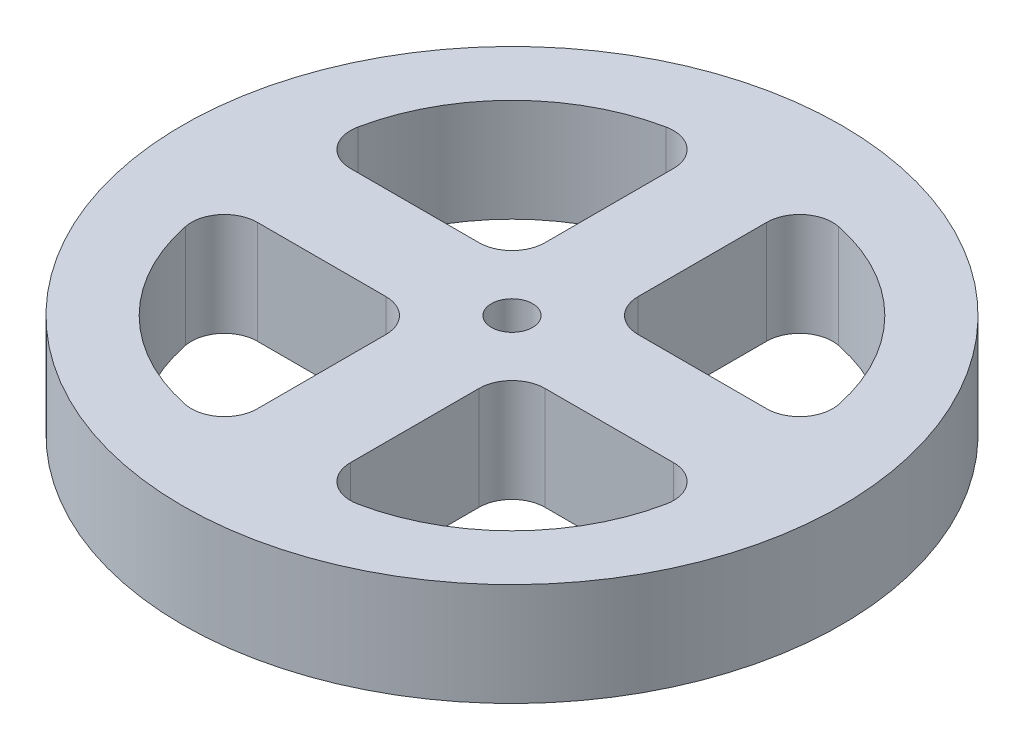
ISO-10303-21;
HEADER;
FILE_DESCRIPTION(('STEP AP214'),'2;1');
FILE_NAME('part.step','',(''),(''),'','','');
FILE_SCHEMA(('AUTOMOTIVE_DESIGN { 1 0 10303 214 1 1 1 1 }'));
ENDSEC;
DATA;
#1=APPLICATION_CONTEXT('core data for automotive mechanical design processes');
#2=APPLICATION_PROTOCOL_DEFINITION('international standard','automotive_design',2000,#1);
#3=PRODUCT_CONTEXT('',#1,'mechanical');
#4=PRODUCT('Part','Part','',(#3));
#5=PRODUCT_RELATED_PRODUCT_CATEGORY('part','',(#4));
#6=PRODUCT_DEFINITION_FORMATION('','',#4);
#7=PRODUCT_DEFINITION_CONTEXT('part definition',#1,'design');
#8=PRODUCT_DEFINITION('design','',#6,#7);
#9=PRODUCT_DEFINITION_SHAPE('','',#8);
#10=(LENGTH_UNIT() NAMED_UNIT(*) SI_UNIT(.MILLI.,.METRE.));
#11=(NAMED_UNIT(*) PLANE_ANGLE_UNIT() SI_UNIT($,.RADIAN.));
#12=(NAMED_UNIT(*) SI_UNIT($,.STERADIAN.) SOLID_ANGLE_UNIT());
#13=UNCERTAINTY_MEASURE_WITH_UNIT(LENGTH_MEASURE(1.E-05),#10,'distance_accuracy_value','');
#14=(GEOMETRIC_REPRESENTATION_CONTEXT(3) GLOBAL_UNCERTAINTY_ASSIGNED_CONTEXT((#13)) GLOBAL_UNIT_ASSIGNED_CONTEXT((#10,
#11,#12)) REPRESENTATION_CONTEXT('',''));
#15=CARTESIAN_POINT('',(0.,0.,0.));
#16=DIRECTION('',(0.,0.,1.));
#17=DIRECTION('',(1.,0.,0.));
#18=AXIS2_PLACEMENT_3D('',#15,#16,#17);
#19=CARTESIAN_POINT('',(0.,1.5875,0.));
#20=DIRECTION('',(0.,1.,0.));
#21=DIRECTION('',(0.,0.,1.));
#22=AXIS2_PLACEMENT_3D('',#19,#20,#21);
#23=PLANE('',#22);
#24=DIRECTION('',(-1.,0.,0.));
#25=VECTOR('',#24,1.);
#26=CARTESIAN_POINT('',(-0.718420489685532,1.5875,0.718420489685534));
#27=LINE('',#26,#25);
#28=CARTESIAN_POINT('',(-1.22642048968553,1.5875,0.718420489685534));
#29=VERTEX_POINT('',#28);
#30=CARTESIAN_POINT('',(-3.20710206835324,1.5875,0.718420489685533));
#31=VERTEX_POINT('',#30);
#32=EDGE_CURVE('E212',#29,#31,#27,.T.);
#33=ORIENTED_EDGE('',*,*,#32,.F.);
#34=CARTESIAN_POINT('',(-1.22642048968553,1.5875,1.22642048968553));
#35=DIRECTION('',(0.,1.,0.));
#36=DIRECTION('',(0.,0.,1.));
#37=AXIS2_PLACEMENT_3D('',#34,#35,#36);
#38=CIRCLE('',#37,0.508);
#39=CARTESIAN_POINT('',(-0.718420489685532,1.5875,1.22642048968553));
#40=VERTEX_POINT('',#39);
#41=EDGE_CURVE('E195',#29,#40,#38,.F.);
#42=ORIENTED_EDGE('',*,*,#41,.T.);
#43=DIRECTION('',(0.,0.,-1.));
#44=VECTOR('',#43,1.);
#45=CARTESIAN_POINT('',(-0.718420489685532,1.5875,0.718420489685534));
#46=LINE('',#45,#44);
#47=CARTESIAN_POINT('',(-0.718420489685532,1.5875,3.20710206835324));
#48=VERTEX_POINT('',#47);
#49=EDGE_CURVE('E224',#48,#40,#46,.T.);
#50=ORIENTED_EDGE('',*,*,#49,.F.);
#51=CARTESIAN_POINT('',(-1.22642048968553,1.5875,3.20710206835324));
#52=DIRECTION('',(0.,1.,0.));
#53=DIRECTION('',(0.,0.,1.));
#54=AXIS2_PLACEMENT_3D('',#51,#52,#53);
#55=CIRCLE('',#54,0.508);
#56=CARTESIAN_POINT('',(-1.32802048968553,1.5875,3.70483838408679));
#57=VERTEX_POINT('',#56);
#58=EDGE_CURVE('E364',#48,#57,#55,.F.);
#59=ORIENTED_EDGE('',*,*,#58,.T.);
#60=CARTESIAN_POINT('',(-0.718420489685532,1.5875,0.718420489685534));
#61=DIRECTION('',(0.,1.,0.));
#62=DIRECTION('',(0.,0.,1.));
#63=AXIS2_PLACEMENT_3D('',#60,#61,#62);
#64=CIRCLE('',#63,3.048);
#65=CARTESIAN_POINT('',(-3.70483838408678,1.5875,1.32802048968553));
#66=VERTEX_POINT('',#65);
#67=EDGE_CURVE('E221',#66,#57,#64,.T.);
#68=ORIENTED_EDGE('',*,*,#67,.F.);
#69=CARTESIAN_POINT('',(-3.20710206835324,1.5875,1.22642048968553));
#70=DIRECTION('',(0.,1.,0.));
#71=DIRECTION('',(0.,0.,1.));
#72=AXIS2_PLACEMENT_3D('',#69,#70,#71);
#73=CIRCLE('',#72,0.508);
#74=EDGE_CURVE('E220',#66,#31,#73,.F.);
#75=ORIENTED_EDGE('',*,*,#74,.T.);
#76=EDGE_LOOP('',(#33,#42,#50,#59,#68,#75));
#77=FACE_BOUND('',#76,.T.);
#78=DIRECTION('',(0.,0.,1.));
#79=VECTOR('',#78,1.);
#80=CARTESIAN_POINT('',(0.718420489685534,1.5875,0.718420489685533));
#81=LINE('',#80,#79);
#82=CARTESIAN_POINT('',(0.718420489685534,1.5875,1.22642048968553));
#83=VERTEX_POINT('',#82);
#84=CARTESIAN_POINT('',(0.718420489685534,1.5875,3.20710206835324));
#85=VERTEX_POINT('',#84);
#86=EDGE_CURVE('E241',#83,#85,#81,.T.);
#87=ORIENTED_EDGE('',*,*,#86,.F.);
#88=CARTESIAN_POINT('',(1.22642048968553,1.5875,1.22642048968553));
#89=DIRECTION('',(0.,1.,0.));
#90=DIRECTION('',(0.,0.,1.));
#91=AXIS2_PLACEMENT_3D('',#88,#89,#90);
#92=CIRCLE('',#91,0.508);
#93=CARTESIAN_POINT('',(1.22642048968553,1.5875,0.718420489685533));
#94=VERTEX_POINT('',#93);
#95=EDGE_CURVE('E307',#83,#94,#92,.F.);
#96=ORIENTED_EDGE('',*,*,#95,.T.);
#97=DIRECTION('',(-1.,0.,0.));
#98=VECTOR('',#97,1.);
#99=CARTESIAN_POINT('',(0.718420489685534,1.5875,0.718420489685533));
#100=LINE('',#99,#98);
#101=CARTESIAN_POINT('',(3.20710206835324,1.5875,0.718420489685532));
#102=VERTEX_POINT('',#101);
#103=EDGE_CURVE('E235',#102,#94,#100,.T.);
#104=ORIENTED_EDGE('',*,*,#103,.F.);
#105=CARTESIAN_POINT('',(3.20710206835324,1.5875,1.22642048968553));
#106=DIRECTION('',(0.,1.,0.));
#107=DIRECTION('',(0.,0.,1.));
#108=AXIS2_PLACEMENT_3D('',#105,#106,#107);
#109=CIRCLE('',#108,0.508);
#110=CARTESIAN_POINT('',(3.70483838408679,1.5875,1.32802048968553));
#111=VERTEX_POINT('',#110);
#112=EDGE_CURVE('E376',#102,#111,#109,.F.);
#113=ORIENTED_EDGE('',*,*,#112,.T.);
#114=CARTESIAN_POINT('',(0.718420489685534,1.5875,0.718420489685533));
#115=DIRECTION('',(0.,1.,0.));
#116=DIRECTION('',(0.,0.,-1.));
#117=AXIS2_PLACEMENT_3D('',#114,#115,#116);
#118=CIRCLE('',#117,3.048);
#119=CARTESIAN_POINT('',(1.32802048968553,1.5875,3.70483838408678));
#120=VERTEX_POINT('',#119);
#121=EDGE_CURVE('E244',#120,#111,#118,.T.);
#122=ORIENTED_EDGE('',*,*,#121,.F.);
#123=CARTESIAN_POINT('',(1.22642048968553,1.5875,3.20710206835324));
#124=DIRECTION('',(0.,1.,0.));
#125=DIRECTION('',(0.,0.,1.));
#126=AXIS2_PLACEMENT_3D('',#123,#124,#125);
#127=CIRCLE('',#126,0.508);
#128=EDGE_CURVE('E368',#120,#85,#127,.F.);
#129=ORIENTED_EDGE('',*,*,#128,.T.);
#130=EDGE_LOOP('',(#87,#96,#104,#113,#122,#129));
#131=FACE_BOUND('',#130,.T.);
#132=DIRECTION('',(0.,0.,1.));
#133=VECTOR('',#132,1.);
#134=CARTESIAN_POINT('',(0.718420489685533,1.5875,-0.718420489685532));
#135=LINE('',#134,#133);
#136=CARTESIAN_POINT('',(0.718420489685533,1.5875,-3.20710206835324));
#137=VERTEX_POINT('',#136);
#138=CARTESIAN_POINT('',(0.718420489685533,1.5875,-1.22642048968553));
#139=VERTEX_POINT('',#138);
#140=EDGE_CURVE('E240',#137,#139,#135,.T.);
#141=ORIENTED_EDGE('',*,*,#140,.F.);
#142=CARTESIAN_POINT('',(1.22642048968553,1.5875,-3.20710206835324));
#143=DIRECTION('',(0.,1.,0.));
#144=DIRECTION('',(0.,0.,1.));
#145=AXIS2_PLACEMENT_3D('',#142,#143,#144);
#146=CIRCLE('',#145,0.508);
#147=CARTESIAN_POINT('',(1.32802048968553,1.5875,-3.70483838408678));
#148=VERTEX_POINT('',#147);
#149=EDGE_CURVE('E380',#137,#148,#146,.F.);
#150=ORIENTED_EDGE('',*,*,#149,.T.);
#151=CARTESIAN_POINT('',(0.718420489685533,1.5875,-0.718420489685532));
#152=DIRECTION('',(0.,1.,0.));
#153=DIRECTION('',(0.,0.,1.));
#154=AXIS2_PLACEMENT_3D('',#151,#152,#153);
#155=CIRCLE('',#154,3.048);
#156=CARTESIAN_POINT('',(3.70483838408678,1.5875,-1.32802048968553));
#157=VERTEX_POINT('',#156);
#158=EDGE_CURVE('E251',#157,#148,#155,.T.);
#159=ORIENTED_EDGE('',*,*,#158,.F.);
#160=CARTESIAN_POINT('',(3.20710206835324,1.5875,-1.22642048968553));
#161=DIRECTION('',(0.,1.,0.));
#162=DIRECTION('',(0.,0.,1.));
#163=AXIS2_PLACEMENT_3D('',#160,#161,#162);
#164=CIRCLE('',#163,0.508);
#165=CARTESIAN_POINT('',(3.20710206835324,1.5875,-0.718420489685532));
#166=VERTEX_POINT('',#165);
#167=EDGE_CURVE('E372',#157,#166,#164,.F.);
#168=ORIENTED_EDGE('',*,*,#167,.T.);
#169=DIRECTION('',(1.,0.,0.));
#170=VECTOR('',#169,1.);
#171=CARTESIAN_POINT('',(0.718420489685533,1.5875,-0.718420489685532));
#172=LINE('',#171,#170);
#173=CARTESIAN_POINT('',(1.22642048968553,1.5875,-0.718420489685532));
#174=VERTEX_POINT('',#173);
#175=EDGE_CURVE('E259',#174,#166,#172,.T.);
#176=ORIENTED_EDGE('',*,*,#175,.F.);
#177=CARTESIAN_POINT('',(1.22642048968553,1.5875,-1.22642048968553));
#178=DIRECTION('',(0.,1.,0.));
#179=DIRECTION('',(0.,0.,1.));
#180=AXIS2_PLACEMENT_3D('',#177,#178,#179);
#181=CIRCLE('',#180,0.508);
#182=EDGE_CURVE('E312',#174,#139,#181,.F.);
#183=ORIENTED_EDGE('',*,*,#182,.T.);
#184=EDGE_LOOP('',(#141,#150,#159,#168,#176,#183));
#185=FACE_BOUND('',#184,.T.);
#186=CARTESIAN_POINT('',(-0.718420489685532,1.5875,-0.718420489685532));
#187=DIRECTION('',(0.,1.,0.));
#188=DIRECTION('',(0.,0.,-1.));
#189=AXIS2_PLACEMENT_3D('',#186,#187,#188);
#190=CIRCLE('',#189,3.048);
#191=CARTESIAN_POINT('',(-1.32802048968553,1.5875,-3.70483838408678));
#192=VERTEX_POINT('',#191);
#193=CARTESIAN_POINT('',(-3.70483838408678,1.5875,-1.32802048968553));
#194=VERTEX_POINT('',#193);
#195=EDGE_CURVE('E257',#192,#194,#190,.T.);
#196=ORIENTED_EDGE('',*,*,#195,.F.);
#197=CARTESIAN_POINT('',(-1.22642048968553,1.5875,-3.20710206835324));
#198=DIRECTION('',(0.,1.,0.));
#199=DIRECTION('',(0.,0.,1.));
#200=AXIS2_PLACEMENT_3D('',#197,#198,#199);
#201=CIRCLE('',#200,0.508);
#202=CARTESIAN_POINT('',(-0.718420489685533,1.5875,-3.20710206835324));
#203=VERTEX_POINT('',#202);
#204=EDGE_CURVE('E41',#192,#203,#201,.F.);
#205=ORIENTED_EDGE('',*,*,#204,.T.);
#206=DIRECTION('',(0.,0.,-1.));
#207=VECTOR('',#206,1.);
#208=CARTESIAN_POINT('',(-0.718420489685532,1.5875,-0.718420489685532));
#209=LINE('',#208,#207);
#210=CARTESIAN_POINT('',(-0.718420489685532,1.5875,-1.22642048968553));
#211=VERTEX_POINT('',#210);
#212=EDGE_CURVE('E268',#211,#203,#209,.T.);
#213=ORIENTED_EDGE('',*,*,#212,.F.);
#214=CARTESIAN_POINT('',(-1.22642048968553,1.5875,-1.22642048968553));
#215=DIRECTION('',(0.,1.,0.));
#216=DIRECTION('',(0.,0.,1.));
#217=AXIS2_PLACEMENT_3D('',#214,#215,#216);
#218=CIRCLE('',#217,0.508);
#219=CARTESIAN_POINT('',(-1.22642048968553,1.5875,-0.718420489685532));
#220=VERTEX_POINT('',#219);
#221=EDGE_CURVE('E317',#211,#220,#218,.F.);
#222=ORIENTED_EDGE('',*,*,#221,.T.);
#223=DIRECTION('',(1.,0.,0.));
#224=VECTOR('',#223,1.);
#225=CARTESIAN_POINT('',(-0.718420489685532,1.5875,-0.718420489685532));
#226=LINE('',#225,#224);
#227=CARTESIAN_POINT('',(-3.20710206835324,1.5875,-0.718420489685531));
#228=VERTEX_POINT('',#227);
#229=EDGE_CURVE('E275',#228,#220,#226,.T.);
#230=ORIENTED_EDGE('',*,*,#229,.F.);
#231=CARTESIAN_POINT('',(-3.20710206835324,1.5875,-1.22642048968553));
#232=DIRECTION('',(0.,1.,0.));
#233=DIRECTION('',(0.,0.,1.));
#234=AXIS2_PLACEMENT_3D('',#231,#232,#233);
#235=CIRCLE('',#234,0.508);
#236=EDGE_CURVE('E384',#228,#194,#235,.F.);
#237=ORIENTED_EDGE('',*,*,#236,.T.);
#238=EDGE_LOOP('',(#196,#205,#213,#222,#230,#237));
#239=FACE_BOUND('',#238,.T.);
#240=CARTESIAN_POINT('',(0.,1.5875,0.));
#241=DIRECTION('',(0.,1.,0.));
#242=DIRECTION('',(0.,0.,1.));
#243=AXIS2_PLACEMENT_3D('',#240,#241,#242);
#244=CIRCLE('',#243,5.08);
#245=CARTESIAN_POINT('',(0.,1.5875,5.08));
#246=VERTEX_POINT('',#245);
#247=EDGE_CURVE('E216',#246,#246,#244,.T.);
#248=ORIENTED_EDGE('',*,*,#247,.T.);
#249=EDGE_LOOP('',(#248));
#250=FACE_BOUND('',#249,.T.);
#251=CARTESIAN_POINT('',(0.,1.5875,0.));
#252=DIRECTION('',(0.,1.,0.));
#253=DIRECTION('',(0.,0.,1.));
#254=AXIS2_PLACEMENT_3D('',#251,#252,#253);
#255=CIRCLE('',#254,0.3175);
#256=CARTESIAN_POINT('',(0.,1.5875,0.3175));
#257=VERTEX_POINT('',#256);
#258=EDGE_CURVE('E278',#257,#257,#255,.T.);
#259=ORIENTED_EDGE('',*,*,#258,.F.);
#260=EDGE_LOOP('',(#259));
#261=FACE_BOUND('',#260,.T.);
#262=ADVANCED_FACE('F33',(#77,#131,#185,#239,#250,#261),#23,.T.);
#263=CARTESIAN_POINT('',(0.,0.,0.));
#264=DIRECTION('',(0.,1.,0.));
#265=DIRECTION('',(0.,0.,1.));
#266=AXIS2_PLACEMENT_3D('',#263,#264,#265);
#267=PLANE('',#266);
#268=CARTESIAN_POINT('',(-0.718420489685532,0.,0.718420489685534));
#269=DIRECTION('',(0.,1.,0.));
#270=DIRECTION('',(0.,0.,1.));
#271=AXIS2_PLACEMENT_3D('',#268,#269,#270);
#272=CIRCLE('',#271,3.048);
#273=CARTESIAN_POINT('',(-3.70483838408678,0.,1.32802048968553));
#274=VERTEX_POINT('',#273);
#275=CARTESIAN_POINT('',(-1.32802048968553,0.,3.70483838408679));
#276=VERTEX_POINT('',#275);
#277=EDGE_CURVE('E692',#274,#276,#272,.T.);
#278=ORIENTED_EDGE('',*,*,#277,.T.);
#279=CARTESIAN_POINT('',(-1.22642048968553,0.,3.20710206835324));
#280=DIRECTION('',(0.,1.,0.));
#281=DIRECTION('',(0.,0.,1.));
#282=AXIS2_PLACEMENT_3D('',#279,#280,#281);
#283=CIRCLE('',#282,0.508);
#284=CARTESIAN_POINT('',(-0.718420489685532,0.,3.20710206835324));
#285=VERTEX_POINT('',#284);
#286=EDGE_CURVE('E366',#276,#285,#283,.T.);
#287=ORIENTED_EDGE('',*,*,#286,.T.);
#288=DIRECTION('',(0.,0.,-1.));
#289=VECTOR('',#288,1.);
#290=CARTESIAN_POINT('',(-0.718420489685532,0.,0.718420489685534));
#291=LINE('',#290,#289);
#292=CARTESIAN_POINT('',(-0.718420489685532,0.,1.22642048968553));
#293=VERTEX_POINT('',#292);
#294=EDGE_CURVE('E227',#285,#293,#291,.T.);
#295=ORIENTED_EDGE('',*,*,#294,.T.);
#296=CARTESIAN_POINT('',(-1.22642048968553,0.,1.22642048968553));
#297=DIRECTION('',(0.,1.,0.));
#298=DIRECTION('',(0.,0.,1.));
#299=AXIS2_PLACEMENT_3D('',#296,#297,#298);
#300=CIRCLE('',#299,0.508);
#301=CARTESIAN_POINT('',(-1.22642048968553,0.,0.718420489685534));
#302=VERTEX_POINT('',#301);
#303=EDGE_CURVE('E205',#293,#302,#300,.T.);
#304=ORIENTED_EDGE('',*,*,#303,.T.);
#305=DIRECTION('',(-1.,0.,0.));
#306=VECTOR('',#305,1.);
#307=CARTESIAN_POINT('',(-0.718420489685532,0.,0.718420489685534));
#308=LINE('',#307,#306);
#309=CARTESIAN_POINT('',(-3.20710206835324,0.,0.718420489685533));
#310=VERTEX_POINT('',#309);
#311=EDGE_CURVE('E215',#302,#310,#308,.T.);
#312=ORIENTED_EDGE('',*,*,#311,.T.);
#313=CARTESIAN_POINT('',(-3.20710206835324,0.,1.22642048968553));
#314=DIRECTION('',(0.,1.,0.));
#315=DIRECTION('',(0.,0.,1.));
#316=AXIS2_PLACEMENT_3D('',#313,#314,#315);
#317=CIRCLE('',#316,0.508);
#318=EDGE_CURVE('E362',#310,#274,#317,.T.);
#319=ORIENTED_EDGE('',*,*,#318,.T.);
#320=EDGE_LOOP('',(#278,#287,#295,#304,#312,#319));
#321=FACE_BOUND('',#320,.T.);
#322=CARTESIAN_POINT('',(0.718420489685534,0.,0.718420489685533));
#323=DIRECTION('',(0.,1.,0.));
#324=DIRECTION('',(0.,0.,-1.));
#325=AXIS2_PLACEMENT_3D('',#322,#323,#324);
#326=CIRCLE('',#325,3.048);
#327=CARTESIAN_POINT('',(1.32802048968553,0.,3.70483838408678));
#328=VERTEX_POINT('',#327);
#329=CARTESIAN_POINT('',(3.70483838408679,0.,1.32802048968553));
#330=VERTEX_POINT('',#329);
#331=EDGE_CURVE('E234',#328,#330,#326,.T.);
#332=ORIENTED_EDGE('',*,*,#331,.T.);
#333=CARTESIAN_POINT('',(3.20710206835324,0.,1.22642048968553));
#334=DIRECTION('',(0.,1.,0.));
#335=DIRECTION('',(0.,0.,1.));
#336=AXIS2_PLACEMENT_3D('',#333,#334,#335);
#337=CIRCLE('',#336,0.508);
#338=CARTESIAN_POINT('',(3.20710206835324,0.,0.718420489685532));
#339=VERTEX_POINT('',#338);
#340=EDGE_CURVE('E378',#330,#339,#337,.T.);
#341=ORIENTED_EDGE('',*,*,#340,.T.);
#342=DIRECTION('',(-1.,0.,0.));
#343=VECTOR('',#342,1.);
#344=CARTESIAN_POINT('',(0.718420489685534,0.,0.718420489685533));
#345=LINE('',#344,#343);
#346=CARTESIAN_POINT('',(1.22642048968553,0.,0.718420489685533));
#347=VERTEX_POINT('',#346);
#348=EDGE_CURVE('E238',#339,#347,#345,.T.);
#349=ORIENTED_EDGE('',*,*,#348,.T.);
#350=CARTESIAN_POINT('',(1.22642048968553,0.,1.22642048968553));
#351=DIRECTION('',(0.,1.,0.));
#352=DIRECTION('',(0.,0.,1.));
#353=AXIS2_PLACEMENT_3D('',#350,#351,#352);
#354=CIRCLE('',#353,0.508);
#355=CARTESIAN_POINT('',(0.718420489685534,0.,1.22642048968553));
#356=VERTEX_POINT('',#355);
#357=EDGE_CURVE('E310',#347,#356,#354,.T.);
#358=ORIENTED_EDGE('',*,*,#357,.T.);
#359=DIRECTION('',(0.,0.,1.));
#360=VECTOR('',#359,1.);
#361=CARTESIAN_POINT('',(0.718420489685534,0.,0.718420489685533));
#362=LINE('',#361,#360);
#363=CARTESIAN_POINT('',(0.718420489685534,0.,3.20710206835324));
#364=VERTEX_POINT('',#363);
#365=EDGE_CURVE('E231',#356,#364,#362,.T.);
#366=ORIENTED_EDGE('',*,*,#365,.T.);
#367=CARTESIAN_POINT('',(1.22642048968553,0.,3.20710206835324));
#368=DIRECTION('',(0.,1.,0.));
#369=DIRECTION('',(0.,0.,1.));
#370=AXIS2_PLACEMENT_3D('',#367,#368,#369);
#371=CIRCLE('',#370,0.508);
#372=EDGE_CURVE('E370',#364,#328,#371,.T.);
#373=ORIENTED_EDGE('',*,*,#372,.T.);
#374=EDGE_LOOP('',(#332,#341,#349,#358,#366,#373));
#375=FACE_BOUND('',#374,.T.);
#376=DIRECTION('',(1.,0.,0.));
#377=VECTOR('',#376,1.);
#378=CARTESIAN_POINT('',(0.718420489685533,0.,-0.718420489685532));
#379=LINE('',#378,#377);
#380=CARTESIAN_POINT('',(1.22642048968553,0.,-0.718420489685532));
#381=VERTEX_POINT('',#380);
#382=CARTESIAN_POINT('',(3.20710206835324,0.,-0.718420489685532));
#383=VERTEX_POINT('',#382);
#384=EDGE_CURVE('E250',#381,#383,#379,.T.);
#385=ORIENTED_EDGE('',*,*,#384,.T.);
#386=CARTESIAN_POINT('',(3.20710206835324,0.,-1.22642048968553));
#387=DIRECTION('',(0.,1.,0.));
#388=DIRECTION('',(0.,0.,1.));
#389=AXIS2_PLACEMENT_3D('',#386,#387,#388);
#390=CIRCLE('',#389,0.508);
#391=CARTESIAN_POINT('',(3.70483838408678,0.,-1.32802048968553));
#392=VERTEX_POINT('',#391);
#393=EDGE_CURVE('E374',#383,#392,#390,.T.);
#394=ORIENTED_EDGE('',*,*,#393,.T.);
#395=CARTESIAN_POINT('',(0.718420489685533,0.,-0.718420489685532));
#396=DIRECTION('',(0.,1.,0.));
#397=DIRECTION('',(0.,0.,1.));
#398=AXIS2_PLACEMENT_3D('',#395,#396,#397);
#399=CIRCLE('',#398,3.048);
#400=CARTESIAN_POINT('',(1.32802048968553,0.,-3.70483838408678));
#401=VERTEX_POINT('',#400);
#402=EDGE_CURVE('E254',#392,#401,#399,.T.);
#403=ORIENTED_EDGE('',*,*,#402,.T.);
#404=CARTESIAN_POINT('',(1.22642048968553,0.,-3.20710206835324));
#405=DIRECTION('',(0.,1.,0.));
#406=DIRECTION('',(0.,0.,1.));
#407=AXIS2_PLACEMENT_3D('',#404,#405,#406);
#408=CIRCLE('',#407,0.508);
#409=CARTESIAN_POINT('',(0.718420489685533,0.,-3.20710206835324));
#410=VERTEX_POINT('',#409);
#411=EDGE_CURVE('E382',#401,#410,#408,.T.);
#412=ORIENTED_EDGE('',*,*,#411,.T.);
#413=DIRECTION('',(0.,0.,1.));
#414=VECTOR('',#413,1.);
#415=CARTESIAN_POINT('',(0.718420489685533,0.,-0.718420489685532));
#416=LINE('',#415,#414);
#417=CARTESIAN_POINT('',(0.718420489685533,0.,-1.22642048968553));
#418=VERTEX_POINT('',#417);
#419=EDGE_CURVE('E248',#410,#418,#416,.T.);
#420=ORIENTED_EDGE('',*,*,#419,.T.);
#421=CARTESIAN_POINT('',(1.22642048968553,0.,-1.22642048968553));
#422=DIRECTION('',(0.,1.,0.));
#423=DIRECTION('',(0.,0.,1.));
#424=AXIS2_PLACEMENT_3D('',#421,#422,#423);
#425=CIRCLE('',#424,0.508);
#426=EDGE_CURVE('E315',#418,#381,#425,.T.);
#427=ORIENTED_EDGE('',*,*,#426,.T.);
#428=EDGE_LOOP('',(#385,#394,#403,#412,#420,#427));
#429=FACE_BOUND('',#428,.T.);
#430=CARTESIAN_POINT('',(-0.718420489685532,0.,-0.718420489685532));
#431=DIRECTION('',(0.,1.,0.));
#432=DIRECTION('',(0.,0.,-1.));
#433=AXIS2_PLACEMENT_3D('',#430,#431,#432);
#434=CIRCLE('',#433,3.048);
#435=CARTESIAN_POINT('',(-1.32802048968553,0.,-3.70483838408678));
#436=VERTEX_POINT('',#435);
#437=CARTESIAN_POINT('',(-3.70483838408678,0.,-1.32802048968553));
#438=VERTEX_POINT('',#437);
#439=EDGE_CURVE('E264',#436,#438,#434,.T.);
#440=ORIENTED_EDGE('',*,*,#439,.T.);
#441=CARTESIAN_POINT('',(-3.20710206835324,0.,-1.22642048968553));
#442=DIRECTION('',(0.,1.,0.));
#443=DIRECTION('',(0.,0.,1.));
#444=AXIS2_PLACEMENT_3D('',#441,#442,#443);
#445=CIRCLE('',#444,0.508);
#446=CARTESIAN_POINT('',(-3.20710206835324,0.,-0.718420489685531));
#447=VERTEX_POINT('',#446);
#448=EDGE_CURVE('E386',#438,#447,#445,.T.);
#449=ORIENTED_EDGE('',*,*,#448,.T.);
#450=DIRECTION('',(1.,0.,0.));
#451=VECTOR('',#450,1.);
#452=CARTESIAN_POINT('',(-0.718420489685532,0.,-0.718420489685532));
#453=LINE('',#452,#451);
#454=CARTESIAN_POINT('',(-1.22642048968553,0.,-0.718420489685532));
#455=VERTEX_POINT('',#454);
#456=EDGE_CURVE('E267',#447,#455,#453,.T.);
#457=ORIENTED_EDGE('',*,*,#456,.T.);
#458=CARTESIAN_POINT('',(-1.22642048968553,0.,-1.22642048968553));
#459=DIRECTION('',(0.,1.,0.));
#460=DIRECTION('',(0.,0.,1.));
#461=AXIS2_PLACEMENT_3D('',#458,#459,#460);
#462=CIRCLE('',#461,0.508);
#463=CARTESIAN_POINT('',(-0.718420489685532,0.,-1.22642048968553));
#464=VERTEX_POINT('',#463);
#465=EDGE_CURVE('E320',#455,#464,#462,.T.);
#466=ORIENTED_EDGE('',*,*,#465,.T.);
#467=DIRECTION('',(0.,0.,-1.));
#468=VECTOR('',#467,1.);
#469=CARTESIAN_POINT('',(-0.718420489685532,0.,-0.718420489685532));
#470=LINE('',#469,#468);
#471=CARTESIAN_POINT('',(-0.718420489685533,0.,-3.20710206835324));
#472=VERTEX_POINT('',#471);
#473=EDGE_CURVE('E270',#464,#472,#470,.T.);
#474=ORIENTED_EDGE('',*,*,#473,.T.);
#475=CARTESIAN_POINT('',(-1.22642048968553,0.,-3.20710206835324));
#476=DIRECTION('',(0.,1.,0.));
#477=DIRECTION('',(0.,0.,1.));
#478=AXIS2_PLACEMENT_3D('',#475,#476,#477);
#479=CIRCLE('',#478,0.508);
#480=EDGE_CURVE('E11',#472,#436,#479,.T.);
#481=ORIENTED_EDGE('',*,*,#480,.T.);
#482=EDGE_LOOP('',(#440,#449,#457,#466,#474,#481));
#483=FACE_BOUND('',#482,.T.);
#484=CARTESIAN_POINT('',(0.,0.,0.));
#485=DIRECTION('',(0.,1.,0.));
#486=DIRECTION('',(0.,0.,1.));
#487=AXIS2_PLACEMENT_3D('',#484,#485,#486);
#488=CIRCLE('',#487,5.08);
#489=CARTESIAN_POINT('',(0.,0.,5.08));
#490=VERTEX_POINT('',#489);
#491=EDGE_CURVE('E281',#490,#490,#488,.T.);
#492=ORIENTED_EDGE('',*,*,#491,.F.);
#493=EDGE_LOOP('',(#492));
#494=FACE_BOUND('',#493,.T.);
#495=CARTESIAN_POINT('',(0.,0.,0.));
#496=DIRECTION('',(0.,1.,0.));
#497=DIRECTION('',(0.,0.,1.));
#498=AXIS2_PLACEMENT_3D('',#495,#496,#497);
#499=CIRCLE('',#498,0.3175);
#500=CARTESIAN_POINT('',(0.,0.,0.3175));
#501=VERTEX_POINT('',#500);
#502=EDGE_CURVE('E272',#501,#501,#499,.T.);
#503=ORIENTED_EDGE('',*,*,#502,.T.);
#504=EDGE_LOOP('',(#503));
#505=FACE_BOUND('',#504,.T.);
#506=ADVANCED_FACE('F390',(#321,#375,#429,#483,#494,#505),#267,.F.);
#507=CARTESIAN_POINT('',(0.,1.5875,0.));
#508=DIRECTION('',(0.,-1.,0.));
#509=DIRECTION('',(0.,0.,-1.));
#510=AXIS2_PLACEMENT_3D('',#507,#508,#509);
#511=CYLINDRICAL_SURFACE('',#510,5.08);
#512=ORIENTED_EDGE('',*,*,#247,.F.);
#513=EDGE_LOOP('',(#512));
#514=FACE_BOUND('',#513,.T.);
#515=ORIENTED_EDGE('',*,*,#491,.T.);
#516=EDGE_LOOP('',(#515));
#517=FACE_BOUND('',#516,.T.);
#518=ADVANCED_FACE('F431',(#514,#517),#511,.T.);
#519=CARTESIAN_POINT('',(0.,1.5875,0.));
#520=DIRECTION('',(0.,-1.,0.));
#521=DIRECTION('',(0.,0.,-1.));
#522=AXIS2_PLACEMENT_3D('',#519,#520,#521);
#523=CYLINDRICAL_SURFACE('',#522,0.3175);
#524=ORIENTED_EDGE('',*,*,#258,.T.);
#525=EDGE_LOOP('',(#524));
#526=FACE_BOUND('',#525,.T.);
#527=ORIENTED_EDGE('',*,*,#502,.F.);
#528=EDGE_LOOP('',(#527));
#529=FACE_BOUND('',#528,.T.);
#530=ADVANCED_FACE('F435',(#526,#529),#523,.F.);
#531=CARTESIAN_POINT('',(-0.718420489685532,0.,-0.718420489685532));
#532=DIRECTION('',(0.,1.,0.));
#533=DIRECTION('',(0.,0.,1.));
#534=AXIS2_PLACEMENT_3D('',#531,#532,#533);
#535=CYLINDRICAL_SURFACE('',#534,3.048);
#536=ORIENTED_EDGE('',*,*,#195,.T.);
#537=DIRECTION('',(0.,1.,0.));
#538=VECTOR('',#537,1.);
#539=CARTESIAN_POINT('',(-3.70483838408678,0.,-1.32802048968553));
#540=LINE('',#539,#538);
#541=EDGE_CURVE('E358',#194,#438,#540,.F.);
#542=ORIENTED_EDGE('',*,*,#541,.T.);
#543=ORIENTED_EDGE('',*,*,#439,.F.);
#544=DIRECTION('',(0.,1.,0.));
#545=VECTOR('',#544,1.);
#546=CARTESIAN_POINT('',(-1.32802048968553,0.,-3.70483838408678));
#547=LINE('',#546,#545);
#548=EDGE_CURVE('E355',#436,#192,#547,.T.);
#549=ORIENTED_EDGE('',*,*,#548,.T.);
#550=EDGE_LOOP('',(#536,#542,#543,#549));
#551=FACE_BOUND('',#550,.T.);
#552=ADVANCED_FACE('F404',(#551),#535,.F.);
#553=CARTESIAN_POINT('',(-0.718420489685532,0.,-0.718420489685532));
#554=DIRECTION('',(1.,0.,0.));
#555=DIRECTION('',(0.,0.,-1.));
#556=AXIS2_PLACEMENT_3D('',#553,#554,#555);
#557=PLANE('',#556);
#558=ORIENTED_EDGE('',*,*,#212,.T.);
#559=DIRECTION('',(0.,-1.,0.));
#560=VECTOR('',#559,1.);
#561=CARTESIAN_POINT('',(-0.718420489685533,0.,-3.20710206835324));
#562=LINE('',#561,#560);
#563=EDGE_CURVE('E54',#203,#472,#562,.T.);
#564=ORIENTED_EDGE('',*,*,#563,.T.);
#565=ORIENTED_EDGE('',*,*,#473,.F.);
#566=DIRECTION('',(0.,1.,0.));
#567=VECTOR('',#566,1.);
#568=CARTESIAN_POINT('',(-0.718420489685532,1.5875,-1.22642048968553));
#569=LINE('',#568,#567);
#570=EDGE_CURVE('E301',#464,#211,#569,.T.);
#571=ORIENTED_EDGE('',*,*,#570,.T.);
#572=EDGE_LOOP('',(#558,#564,#565,#571));
#573=FACE_BOUND('',#572,.T.);
#574=ADVANCED_FACE('F409',(#573),#557,.F.);
#575=CARTESIAN_POINT('',(-0.718420489685532,0.,-0.718420489685532));
#576=DIRECTION('',(0.,0.,1.));
#577=DIRECTION('',(1.,0.,0.));
#578=AXIS2_PLACEMENT_3D('',#575,#576,#577);
#579=PLANE('',#578);
#580=ORIENTED_EDGE('',*,*,#456,.F.);
#581=DIRECTION('',(0.,-1.,0.));
#582=VECTOR('',#581,1.);
#583=CARTESIAN_POINT('',(-3.20710206835324,1.5875,-0.718420489685531));
#584=LINE('',#583,#582);
#585=EDGE_CURVE('E352',#447,#228,#584,.F.);
#586=ORIENTED_EDGE('',*,*,#585,.T.);
#587=ORIENTED_EDGE('',*,*,#229,.T.);
#588=DIRECTION('',(0.,1.,0.));
#589=VECTOR('',#588,1.);
#590=CARTESIAN_POINT('',(-1.22642048968553,0.,-0.718420489685532));
#591=LINE('',#590,#589);
#592=EDGE_CURVE('E206',#220,#455,#591,.F.);
#593=ORIENTED_EDGE('',*,*,#592,.T.);
#594=EDGE_LOOP('',(#580,#586,#587,#593));
#595=FACE_BOUND('',#594,.T.);
#596=ADVANCED_FACE('F397',(#595),#579,.F.);
#597=CARTESIAN_POINT('',(0.718420489685533,0.,-0.718420489685532));
#598=DIRECTION('',(-1.,0.,0.));
#599=DIRECTION('',(0.,0.,1.));
#600=AXIS2_PLACEMENT_3D('',#597,#598,#599);
#601=PLANE('',#600);
#602=ORIENTED_EDGE('',*,*,#419,.F.);
#603=DIRECTION('',(0.,-1.,0.));
#604=VECTOR('',#603,1.);
#605=CARTESIAN_POINT('',(0.718420489685533,1.5875,-3.20710206835324));
#606=LINE('',#605,#604);
#607=EDGE_CURVE('E349',#410,#137,#606,.F.);
#608=ORIENTED_EDGE('',*,*,#607,.T.);
#609=ORIENTED_EDGE('',*,*,#140,.T.);
#610=DIRECTION('',(0.,1.,0.));
#611=VECTOR('',#610,1.);
#612=CARTESIAN_POINT('',(0.718420489685533,0.,-1.22642048968553));
#613=LINE('',#612,#611);
#614=EDGE_CURVE('E298',#139,#418,#613,.F.);
#615=ORIENTED_EDGE('',*,*,#614,.T.);
#616=EDGE_LOOP('',(#602,#608,#609,#615));
#617=FACE_BOUND('',#616,.T.);
#618=ADVANCED_FACE('F482',(#617),#601,.F.);
#619=CARTESIAN_POINT('',(0.718420489685533,0.,-0.718420489685532));
#620=DIRECTION('',(0.,1.,0.));
#621=DIRECTION('',(0.,0.,1.));
#622=AXIS2_PLACEMENT_3D('',#619,#620,#621);
#623=CYLINDRICAL_SURFACE('',#622,3.048);
#624=ORIENTED_EDGE('',*,*,#402,.F.);
#625=DIRECTION('',(0.,1.,0.));
#626=VECTOR('',#625,1.);
#627=CARTESIAN_POINT('',(3.70483838408679,0.,-1.32802048968553));
#628=LINE('',#627,#626);
#629=EDGE_CURVE('E341',#392,#157,#628,.T.);
#630=ORIENTED_EDGE('',*,*,#629,.T.);
#631=ORIENTED_EDGE('',*,*,#158,.T.);
#632=DIRECTION('',(0.,1.,0.));
#633=VECTOR('',#632,1.);
#634=CARTESIAN_POINT('',(1.32802048968553,0.,-3.70483838408678));
#635=LINE('',#634,#633);
#636=EDGE_CURVE('E339',#148,#401,#635,.F.);
#637=ORIENTED_EDGE('',*,*,#636,.T.);
#638=EDGE_LOOP('',(#624,#630,#631,#637));
#639=FACE_BOUND('',#638,.T.);
#640=ADVANCED_FACE('F491',(#639),#623,.F.);
#641=CARTESIAN_POINT('',(0.718420489685533,0.,-0.718420489685532));
#642=DIRECTION('',(0.,0.,1.));
#643=DIRECTION('',(1.,0.,0.));
#644=AXIS2_PLACEMENT_3D('',#641,#642,#643);
#645=PLANE('',#644);
#646=ORIENTED_EDGE('',*,*,#175,.T.);
#647=DIRECTION('',(0.,-1.,0.));
#648=VECTOR('',#647,1.);
#649=CARTESIAN_POINT('',(3.20710206835324,0.,-0.718420489685532));
#650=LINE('',#649,#648);
#651=EDGE_CURVE('E344',#166,#383,#650,.T.);
#652=ORIENTED_EDGE('',*,*,#651,.T.);
#653=ORIENTED_EDGE('',*,*,#384,.F.);
#654=DIRECTION('',(0.,1.,0.));
#655=VECTOR('',#654,1.);
#656=CARTESIAN_POINT('',(1.22642048968553,1.5875,-0.718420489685532));
#657=LINE('',#656,#655);
#658=EDGE_CURVE('E295',#381,#174,#657,.T.);
#659=ORIENTED_EDGE('',*,*,#658,.T.);
#660=EDGE_LOOP('',(#646,#652,#653,#659));
#661=FACE_BOUND('',#660,.T.);
#662=ADVANCED_FACE('F499',(#661),#645,.F.);
#663=CARTESIAN_POINT('',(0.718420489685534,0.,0.718420489685533));
#664=DIRECTION('',(-1.,0.,0.));
#665=DIRECTION('',(0.,0.,1.));
#666=AXIS2_PLACEMENT_3D('',#663,#664,#665);
#667=PLANE('',#666);
#668=ORIENTED_EDGE('',*,*,#86,.T.);
#669=DIRECTION('',(0.,-1.,0.));
#670=VECTOR('',#669,1.);
#671=CARTESIAN_POINT('',(0.718420489685534,0.,3.20710206835324));
#672=LINE('',#671,#670);
#673=EDGE_CURVE('E337',#85,#364,#672,.T.);
#674=ORIENTED_EDGE('',*,*,#673,.T.);
#675=ORIENTED_EDGE('',*,*,#365,.F.);
#676=DIRECTION('',(0.,1.,0.));
#677=VECTOR('',#676,1.);
#678=CARTESIAN_POINT('',(0.718420489685534,1.5875,1.22642048968553));
#679=LINE('',#678,#677);
#680=EDGE_CURVE('E289',#356,#83,#679,.T.);
#681=ORIENTED_EDGE('',*,*,#680,.T.);
#682=EDGE_LOOP('',(#668,#674,#675,#681));
#683=FACE_BOUND('',#682,.T.);
#684=ADVANCED_FACE('F457',(#683),#667,.F.);
#685=CARTESIAN_POINT('',(0.718420489685534,0.,0.718420489685533));
#686=DIRECTION('',(0.,0.,-1.));
#687=DIRECTION('',(-1.,0.,0.));
#688=AXIS2_PLACEMENT_3D('',#685,#686,#687);
#689=PLANE('',#688);
#690=ORIENTED_EDGE('',*,*,#348,.F.);
#691=DIRECTION('',(0.,-1.,0.));
#692=VECTOR('',#691,1.);
#693=CARTESIAN_POINT('',(3.20710206835324,1.5875,0.718420489685532));
#694=LINE('',#693,#692);
#695=EDGE_CURVE('E346',#339,#102,#694,.F.);
#696=ORIENTED_EDGE('',*,*,#695,.T.);
#697=ORIENTED_EDGE('',*,*,#103,.T.);
#698=DIRECTION('',(0.,1.,0.));
#699=VECTOR('',#698,1.);
#700=CARTESIAN_POINT('',(1.22642048968553,0.,0.718420489685533));
#701=LINE('',#700,#699);
#702=EDGE_CURVE('E292',#94,#347,#701,.F.);
#703=ORIENTED_EDGE('',*,*,#702,.T.);
#704=EDGE_LOOP('',(#690,#696,#697,#703));
#705=FACE_BOUND('',#704,.T.);
#706=ADVANCED_FACE('F473',(#705),#689,.F.);
#707=CARTESIAN_POINT('',(0.718420489685534,0.,0.718420489685533));
#708=DIRECTION('',(0.,1.,0.));
#709=DIRECTION('',(0.,0.,1.));
#710=AXIS2_PLACEMENT_3D('',#707,#708,#709);
#711=CYLINDRICAL_SURFACE('',#710,3.048);
#712=ORIENTED_EDGE('',*,*,#331,.F.);
#713=DIRECTION('',(0.,1.,0.));
#714=VECTOR('',#713,1.);
#715=CARTESIAN_POINT('',(1.32802048968553,0.,3.70483838408679));
#716=LINE('',#715,#714);
#717=EDGE_CURVE('E334',#328,#120,#716,.T.);
#718=ORIENTED_EDGE('',*,*,#717,.T.);
#719=ORIENTED_EDGE('',*,*,#121,.T.);
#720=DIRECTION('',(0.,1.,0.));
#721=VECTOR('',#720,1.);
#722=CARTESIAN_POINT('',(3.70483838408679,0.,1.32802048968553));
#723=LINE('',#722,#721);
#724=EDGE_CURVE('E332',#111,#330,#723,.F.);
#725=ORIENTED_EDGE('',*,*,#724,.T.);
#726=EDGE_LOOP('',(#712,#718,#719,#725));
#727=FACE_BOUND('',#726,.T.);
#728=ADVANCED_FACE('F466',(#727),#711,.F.);
#729=CARTESIAN_POINT('',(-0.718420489685532,0.,0.718420489685534));
#730=DIRECTION('',(0.,0.,-1.));
#731=DIRECTION('',(-1.,0.,0.));
#732=AXIS2_PLACEMENT_3D('',#729,#730,#731);
#733=PLANE('',#732);
#734=ORIENTED_EDGE('',*,*,#32,.T.);
#735=DIRECTION('',(0.,-1.,0.));
#736=VECTOR('',#735,1.);
#737=CARTESIAN_POINT('',(-3.20710206835324,0.,0.718420489685533));
#738=LINE('',#737,#736);
#739=EDGE_CURVE('E327',#31,#310,#738,.T.);
#740=ORIENTED_EDGE('',*,*,#739,.T.);
#741=ORIENTED_EDGE('',*,*,#311,.F.);
#742=DIRECTION('',(0.,1.,0.));
#743=VECTOR('',#742,1.);
#744=CARTESIAN_POINT('',(-1.22642048968553,1.5875,0.718420489685534));
#745=LINE('',#744,#743);
#746=EDGE_CURVE('E199',#302,#29,#745,.T.);
#747=ORIENTED_EDGE('',*,*,#746,.T.);
#748=EDGE_LOOP('',(#734,#740,#741,#747));
#749=FACE_BOUND('',#748,.T.);
#750=ADVANCED_FACE('F211',(#749),#733,.F.);
#751=CARTESIAN_POINT('',(-0.718420489685532,0.,0.718420489685534));
#752=DIRECTION('',(1.,0.,0.));
#753=DIRECTION('',(0.,0.,-1.));
#754=AXIS2_PLACEMENT_3D('',#751,#752,#753);
#755=PLANE('',#754);
#756=ORIENTED_EDGE('',*,*,#294,.F.);
#757=DIRECTION('',(0.,-1.,0.));
#758=VECTOR('',#757,1.);
#759=CARTESIAN_POINT('',(-0.718420489685532,1.5875,3.20710206835324));
#760=LINE('',#759,#758);
#761=EDGE_CURVE('E329',#285,#48,#760,.F.);
#762=ORIENTED_EDGE('',*,*,#761,.T.);
#763=ORIENTED_EDGE('',*,*,#49,.T.);
#764=DIRECTION('',(0.,1.,0.));
#765=VECTOR('',#764,1.);
#766=CARTESIAN_POINT('',(-0.718420489685532,0.,1.22642048968553));
#767=LINE('',#766,#765);
#768=EDGE_CURVE('E201',#40,#293,#767,.F.);
#769=ORIENTED_EDGE('',*,*,#768,.T.);
#770=EDGE_LOOP('',(#756,#762,#763,#769));
#771=FACE_BOUND('',#770,.T.);
#772=ADVANCED_FACE('F601',(#771),#755,.F.);
#773=CARTESIAN_POINT('',(-0.718420489685532,0.,0.718420489685534));
#774=DIRECTION('',(0.,1.,0.));
#775=DIRECTION('',(0.,0.,1.));
#776=AXIS2_PLACEMENT_3D('',#773,#774,#775);
#777=CYLINDRICAL_SURFACE('',#776,3.048);
#778=ORIENTED_EDGE('',*,*,#277,.F.);
#779=DIRECTION('',(0.,1.,0.));
#780=VECTOR('',#779,1.);
#781=CARTESIAN_POINT('',(-3.70483838408678,0.,1.32802048968553));
#782=LINE('',#781,#780);
#783=EDGE_CURVE('E324',#274,#66,#782,.T.);
#784=ORIENTED_EDGE('',*,*,#783,.T.);
#785=ORIENTED_EDGE('',*,*,#67,.T.);
#786=DIRECTION('',(0.,1.,0.));
#787=VECTOR('',#786,1.);
#788=CARTESIAN_POINT('',(-1.32802048968553,0.,3.70483838408679));
#789=LINE('',#788,#787);
#790=EDGE_CURVE('E322',#57,#276,#789,.F.);
#791=ORIENTED_EDGE('',*,*,#790,.T.);
#792=EDGE_LOOP('',(#778,#784,#785,#791));
#793=FACE_BOUND('',#792,.T.);
#794=ADVANCED_FACE('F443',(#793),#777,.F.);
#795=CARTESIAN_POINT('',(-1.22642048968553,0.,1.22642048968553));
#796=DIRECTION('',(0.,-1.,0.));
#797=DIRECTION('',(0.,0.,-1.));
#798=AXIS2_PLACEMENT_3D('',#795,#796,#797);
#799=CYLINDRICAL_SURFACE('',#798,0.508);
#800=ORIENTED_EDGE('',*,*,#303,.F.);
#801=ORIENTED_EDGE('',*,*,#768,.F.);
#802=ORIENTED_EDGE('',*,*,#41,.F.);
#803=ORIENTED_EDGE('',*,*,#746,.F.);
#804=EDGE_LOOP('',(#800,#801,#802,#803));
#805=FACE_BOUND('',#804,.T.);
#806=ADVANCED_FACE('F198',(#805),#799,.F.);
#807=CARTESIAN_POINT('',(1.22642048968553,0.,1.22642048968553));
#808=DIRECTION('',(0.,-1.,0.));
#809=DIRECTION('',(0.,0.,-1.));
#810=AXIS2_PLACEMENT_3D('',#807,#808,#809);
#811=CYLINDRICAL_SURFACE('',#810,0.508);
#812=ORIENTED_EDGE('',*,*,#357,.F.);
#813=ORIENTED_EDGE('',*,*,#702,.F.);
#814=ORIENTED_EDGE('',*,*,#95,.F.);
#815=ORIENTED_EDGE('',*,*,#680,.F.);
#816=EDGE_LOOP('',(#812,#813,#814,#815));
#817=FACE_BOUND('',#816,.T.);
#818=ADVANCED_FACE('F423',(#817),#811,.F.);
#819=CARTESIAN_POINT('',(1.22642048968553,0.,-1.22642048968553));
#820=DIRECTION('',(0.,-1.,0.));
#821=DIRECTION('',(0.,0.,-1.));
#822=AXIS2_PLACEMENT_3D('',#819,#820,#821);
#823=CYLINDRICAL_SURFACE('',#822,0.508);
#824=ORIENTED_EDGE('',*,*,#426,.F.);
#825=ORIENTED_EDGE('',*,*,#614,.F.);
#826=ORIENTED_EDGE('',*,*,#182,.F.);
#827=ORIENTED_EDGE('',*,*,#658,.F.);
#828=EDGE_LOOP('',(#824,#825,#826,#827));
#829=FACE_BOUND('',#828,.T.);
#830=ADVANCED_FACE('F414',(#829),#823,.F.);
#831=CARTESIAN_POINT('',(-1.22642048968553,0.,-1.22642048968553));
#832=DIRECTION('',(0.,-1.,0.));
#833=DIRECTION('',(0.,0.,-1.));
#834=AXIS2_PLACEMENT_3D('',#831,#832,#833);
#835=CYLINDRICAL_SURFACE('',#834,0.508);
#836=ORIENTED_EDGE('',*,*,#465,.F.);
#837=ORIENTED_EDGE('',*,*,#592,.F.);
#838=ORIENTED_EDGE('',*,*,#221,.F.);
#839=ORIENTED_EDGE('',*,*,#570,.F.);
#840=EDGE_LOOP('',(#836,#837,#838,#839));
#841=FACE_BOUND('',#840,.T.);
#842=ADVANCED_FACE('F411',(#841),#835,.F.);
#843=CARTESIAN_POINT('',(-3.20710206835324,0.,1.22642048968553));
#844=DIRECTION('',(0.,1.,0.));
#845=DIRECTION('',(0.,0.,1.));
#846=AXIS2_PLACEMENT_3D('',#843,#844,#845);
#847=CYLINDRICAL_SURFACE('',#846,0.508);
#848=ORIENTED_EDGE('',*,*,#318,.F.);
#849=ORIENTED_EDGE('',*,*,#739,.F.);
#850=ORIENTED_EDGE('',*,*,#74,.F.);
#851=ORIENTED_EDGE('',*,*,#783,.F.);
#852=EDGE_LOOP('',(#848,#849,#850,#851));
#853=FACE_BOUND('',#852,.T.);
#854=ADVANCED_FACE('F413',(#853),#847,.F.);
#855=CARTESIAN_POINT('',(-1.22642048968553,0.,3.20710206835324));
#856=DIRECTION('',(0.,1.,0.));
#857=DIRECTION('',(0.,0.,1.));
#858=AXIS2_PLACEMENT_3D('',#855,#856,#857);
#859=CYLINDRICAL_SURFACE('',#858,0.508);
#860=ORIENTED_EDGE('',*,*,#286,.F.);
#861=ORIENTED_EDGE('',*,*,#790,.F.);
#862=ORIENTED_EDGE('',*,*,#58,.F.);
#863=ORIENTED_EDGE('',*,*,#761,.F.);
#864=EDGE_LOOP('',(#860,#861,#862,#863));
#865=FACE_BOUND('',#864,.T.);
#866=ADVANCED_FACE('F420',(#865),#859,.F.);
#867=CARTESIAN_POINT('',(1.22642048968553,0.,3.20710206835324));
#868=DIRECTION('',(0.,1.,0.));
#869=DIRECTION('',(0.,0.,1.));
#870=AXIS2_PLACEMENT_3D('',#867,#868,#869);
#871=CYLINDRICAL_SURFACE('',#870,0.508);
#872=ORIENTED_EDGE('',*,*,#372,.F.);
#873=ORIENTED_EDGE('',*,*,#673,.F.);
#874=ORIENTED_EDGE('',*,*,#128,.F.);
#875=ORIENTED_EDGE('',*,*,#717,.F.);
#876=EDGE_LOOP('',(#872,#873,#874,#875));
#877=FACE_BOUND('',#876,.T.);
#878=ADVANCED_FACE('F461',(#877),#871,.F.);
#879=CARTESIAN_POINT('',(3.20710206835324,0.,-1.22642048968553));
#880=DIRECTION('',(0.,1.,0.));
#881=DIRECTION('',(0.,0.,1.));
#882=AXIS2_PLACEMENT_3D('',#879,#880,#881);
#883=CYLINDRICAL_SURFACE('',#882,0.508);
#884=ORIENTED_EDGE('',*,*,#393,.F.);
#885=ORIENTED_EDGE('',*,*,#651,.F.);
#886=ORIENTED_EDGE('',*,*,#167,.F.);
#887=ORIENTED_EDGE('',*,*,#629,.F.);
#888=EDGE_LOOP('',(#884,#885,#886,#887));
#889=FACE_BOUND('',#888,.T.);
#890=ADVANCED_FACE('F497',(#889),#883,.F.);
#891=CARTESIAN_POINT('',(3.20710206835324,0.,1.22642048968553));
#892=DIRECTION('',(0.,1.,0.));
#893=DIRECTION('',(0.,0.,1.));
#894=AXIS2_PLACEMENT_3D('',#891,#892,#893);
#895=CYLINDRICAL_SURFACE('',#894,0.508);
#896=ORIENTED_EDGE('',*,*,#340,.F.);
#897=ORIENTED_EDGE('',*,*,#724,.F.);
#898=ORIENTED_EDGE('',*,*,#112,.F.);
#899=ORIENTED_EDGE('',*,*,#695,.F.);
#900=EDGE_LOOP('',(#896,#897,#898,#899));
#901=FACE_BOUND('',#900,.T.);
#902=ADVANCED_FACE('F470',(#901),#895,.F.);
#903=CARTESIAN_POINT('',(1.22642048968553,0.,-3.20710206835324));
#904=DIRECTION('',(0.,1.,0.));
#905=DIRECTION('',(0.,0.,1.));
#906=AXIS2_PLACEMENT_3D('',#903,#904,#905);
#907=CYLINDRICAL_SURFACE('',#906,0.508);
#908=ORIENTED_EDGE('',*,*,#411,.F.);
#909=ORIENTED_EDGE('',*,*,#636,.F.);
#910=ORIENTED_EDGE('',*,*,#149,.F.);
#911=ORIENTED_EDGE('',*,*,#607,.F.);
#912=EDGE_LOOP('',(#908,#909,#910,#911));
#913=FACE_BOUND('',#912,.T.);
#914=ADVANCED_FACE('F487',(#913),#907,.F.);
#915=CARTESIAN_POINT('',(-3.20710206835324,0.,-1.22642048968553));
#916=DIRECTION('',(0.,1.,0.));
#917=DIRECTION('',(0.,0.,1.));
#918=AXIS2_PLACEMENT_3D('',#915,#916,#917);
#919=CYLINDRICAL_SURFACE('',#918,0.508);
#920=ORIENTED_EDGE('',*,*,#448,.F.);
#921=ORIENTED_EDGE('',*,*,#541,.F.);
#922=ORIENTED_EDGE('',*,*,#236,.F.);
#923=ORIENTED_EDGE('',*,*,#585,.F.);
#924=EDGE_LOOP('',(#920,#921,#922,#923));
#925=FACE_BOUND('',#924,.T.);
#926=ADVANCED_FACE('F401',(#925),#919,.F.);
#927=CARTESIAN_POINT('',(-1.22642048968553,0.,-3.20710206835324));
#928=DIRECTION('',(0.,1.,0.));
#929=DIRECTION('',(0.,0.,1.));
#930=AXIS2_PLACEMENT_3D('',#927,#928,#929);
#931=CYLINDRICAL_SURFACE('',#930,0.508);
#932=ORIENTED_EDGE('',*,*,#480,.F.);
#933=ORIENTED_EDGE('',*,*,#563,.F.);
#934=ORIENTED_EDGE('',*,*,#204,.F.);
#935=ORIENTED_EDGE('',*,*,#548,.F.);
#936=EDGE_LOOP('',(#932,#933,#934,#935));
#937=FACE_BOUND('',#936,.T.);
#938=ADVANCED_FACE('F35',(#937),#931,.F.);
#939=CLOSED_SHELL('',(#262,#506,#518,#530,#552,#574,#596,#618,#640,#662,#684,#706,#728,#750,
#772,#794,#806,#818,#830,#842,#854,#866,#878,#890,#902,#914,#926,#938));
#940=MANIFOLD_SOLID_BREP('B2',#939);
#941=ADVANCED_BREP_SHAPE_REPRESENTATION('',(#18,#940),#14);
#942=SHAPE_DEFINITION_REPRESENTATION(#9,#941);
ENDSEC;
END-ISO-10303-21;
